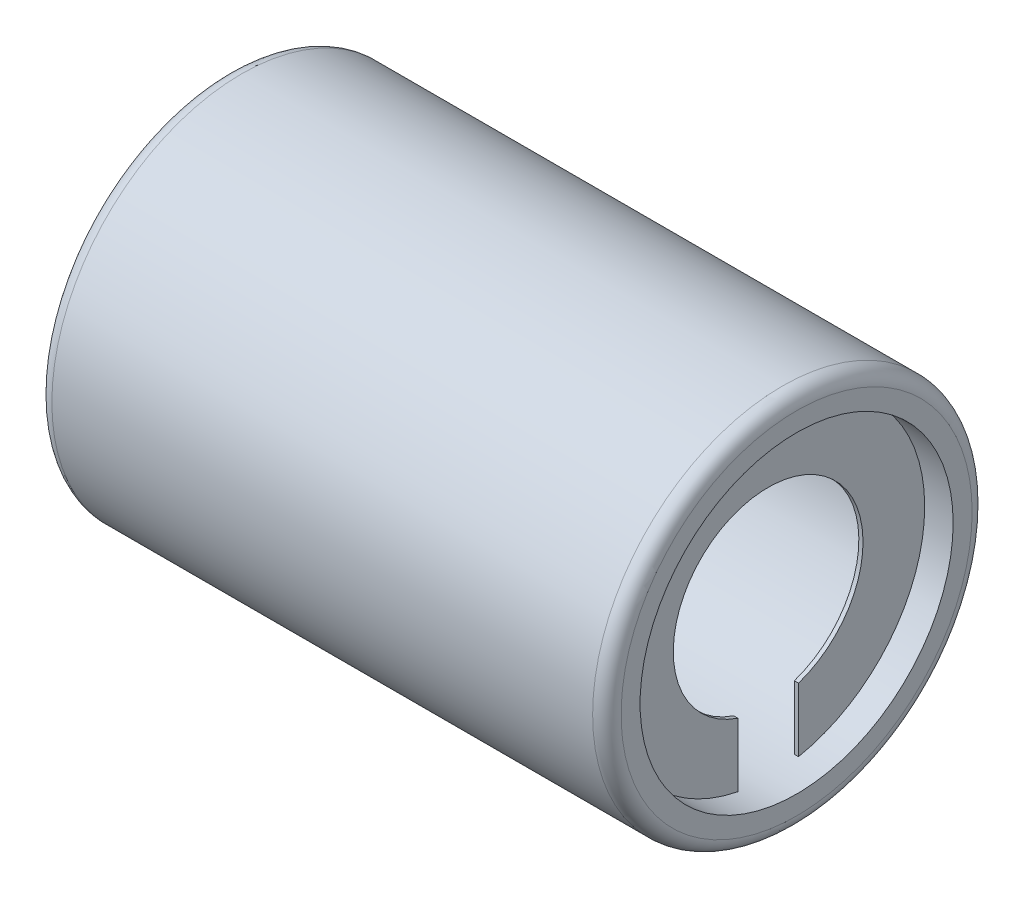
ISO-10303-21;
HEADER;
FILE_DESCRIPTION(('STEP AP214'),'2;1');
FILE_NAME('part.step','',(''),(''),'','','');
FILE_SCHEMA(('AUTOMOTIVE_DESIGN { 1 0 10303 214 1 1 1 1 }'));
ENDSEC;
DATA;
#1=APPLICATION_CONTEXT('core data for automotive mechanical design processes');
#2=APPLICATION_PROTOCOL_DEFINITION('international standard','automotive_design',2000,#1);
#3=PRODUCT_CONTEXT('',#1,'mechanical');
#4=PRODUCT('Part','Part','',(#3));
#5=PRODUCT_RELATED_PRODUCT_CATEGORY('part','',(#4));
#6=PRODUCT_DEFINITION_FORMATION('','',#4);
#7=PRODUCT_DEFINITION_CONTEXT('part definition',#1,'design');
#8=PRODUCT_DEFINITION('design','',#6,#7);
#9=PRODUCT_DEFINITION_SHAPE('','',#8);
#10=(LENGTH_UNIT() NAMED_UNIT(*) SI_UNIT(.MILLI.,.METRE.));
#11=(NAMED_UNIT(*) PLANE_ANGLE_UNIT() SI_UNIT($,.RADIAN.));
#12=(NAMED_UNIT(*) SI_UNIT($,.STERADIAN.) SOLID_ANGLE_UNIT());
#13=UNCERTAINTY_MEASURE_WITH_UNIT(LENGTH_MEASURE(1.E-05),#10,'distance_accuracy_value','');
#14=(GEOMETRIC_REPRESENTATION_CONTEXT(3) GLOBAL_UNCERTAINTY_ASSIGNED_CONTEXT((#13)) GLOBAL_UNIT_ASSIGNED_CONTEXT((#10,
#11,#12)) REPRESENTATION_CONTEXT('',''));
#15=CARTESIAN_POINT('',(0.,0.,0.));
#16=DIRECTION('',(0.,0.,1.));
#17=DIRECTION('',(1.,0.,0.));
#18=AXIS2_PLACEMENT_3D('',#15,#16,#17);
#19=CARTESIAN_POINT('',(12.,0.,0.));
#20=DIRECTION('',(1.,0.,0.));
#21=DIRECTION('',(0.,0.,-1.));
#22=AXIS2_PLACEMENT_3D('',#19,#20,#21);
#23=CYLINDRICAL_SURFACE('',#22,3.29999999999999);
#24=CARTESIAN_POINT('',(12.,0.,0.));
#25=DIRECTION('',(1.,0.,0.));
#26=DIRECTION('',(0.,0.,-1.));
#27=AXIS2_PLACEMENT_3D('',#24,#25,#26);
#28=CIRCLE('',#27,3.29999999999999);
#29=CARTESIAN_POINT('',(12.,0.,-3.29999999999999));
#30=VERTEX_POINT('',#29);
#31=EDGE_CURVE('E90',#30,#30,#28,.T.);
#32=ORIENTED_EDGE('',*,*,#31,.T.);
#33=EDGE_LOOP('',(#32));
#34=FACE_BOUND('',#33,.T.);
#35=CARTESIAN_POINT('',(11.4,0.,0.));
#36=DIRECTION('',(-1.,0.,0.));
#37=DIRECTION('',(0.,0.,1.));
#38=AXIS2_PLACEMENT_3D('',#35,#36,#37);
#39=CIRCLE('',#38,3.30000000000002);
#40=CARTESIAN_POINT('',(11.4,-3.2373445908646,0.64));
#41=VERTEX_POINT('',#40);
#42=CARTESIAN_POINT('',(11.4,-3.23734459086458,-0.639999999999994));
#43=VERTEX_POINT('',#42);
#44=EDGE_CURVE('E87',#41,#43,#39,.T.);
#45=ORIENTED_EDGE('',*,*,#44,.T.);
#46=DIRECTION('',(-1.,0.,0.));
#47=VECTOR('',#46,1.);
#48=CARTESIAN_POINT('',(11.4,-3.23734459086458,-0.639999999999994));
#49=LINE('',#48,#47);
#50=CARTESIAN_POINT('',(11.312,-3.23734459086458,-0.639999999999994));
#51=VERTEX_POINT('',#50);
#52=EDGE_CURVE('E61',#43,#51,#49,.T.);
#53=ORIENTED_EDGE('',*,*,#52,.T.);
#54=CARTESIAN_POINT('',(11.312,0.,0.));
#55=DIRECTION('',(-1.,0.,0.));
#56=DIRECTION('',(0.,0.,1.));
#57=AXIS2_PLACEMENT_3D('',#54,#55,#56);
#58=CIRCLE('',#57,3.30000000000002);
#59=CARTESIAN_POINT('',(11.312,-3.23734459086454,0.64));
#60=VERTEX_POINT('',#59);
#61=EDGE_CURVE('E73',#60,#51,#58,.T.);
#62=ORIENTED_EDGE('',*,*,#61,.F.);
#63=DIRECTION('',(-1.,0.,0.));
#64=VECTOR('',#63,1.);
#65=CARTESIAN_POINT('',(11.4,-3.2373445908646,0.64));
#66=LINE('',#65,#64);
#67=EDGE_CURVE('E88',#41,#60,#66,.T.);
#68=ORIENTED_EDGE('',*,*,#67,.F.);
#69=EDGE_LOOP('',(#45,#53,#62,#68));
#70=FACE_BOUND('',#69,.T.);
#71=CARTESIAN_POINT('',(0.,0.,0.));
#72=DIRECTION('',(1.,0.,0.));
#73=DIRECTION('',(0.,0.,-1.));
#74=AXIS2_PLACEMENT_3D('',#71,#72,#73);
#75=CIRCLE('',#74,3.29999999999999);
#76=CARTESIAN_POINT('',(0.,0.,-3.29999999999999));
#77=VERTEX_POINT('',#76);
#78=EDGE_CURVE('E99',#77,#77,#75,.T.);
#79=ORIENTED_EDGE('',*,*,#78,.F.);
#80=EDGE_LOOP('',(#79));
#81=FACE_BOUND('',#80,.T.);
#82=ADVANCED_FACE('F37',(#34,#70,#81),#23,.F.);
#83=CARTESIAN_POINT('',(12.,0.,0.));
#84=DIRECTION('',(-1.,0.,0.));
#85=DIRECTION('',(0.,0.,1.));
#86=AXIS2_PLACEMENT_3D('',#83,#84,#85);
#87=CYLINDRICAL_SURFACE('',#86,4.);
#88=CARTESIAN_POINT('',(0.3,0.,0.));
#89=DIRECTION('',(-1.,0.,0.));
#90=DIRECTION('',(0.,0.,1.));
#91=AXIS2_PLACEMENT_3D('',#88,#89,#90);
#92=CIRCLE('',#91,4.);
#93=CARTESIAN_POINT('',(0.3,0.,4.));
#94=VERTEX_POINT('',#93);
#95=EDGE_CURVE('E45',#94,#94,#92,.F.);
#96=ORIENTED_EDGE('',*,*,#95,.T.);
#97=EDGE_LOOP('',(#96));
#98=FACE_BOUND('',#97,.T.);
#99=CARTESIAN_POINT('',(11.7,0.,0.));
#100=DIRECTION('',(1.,0.,0.));
#101=DIRECTION('',(0.,0.,-1.));
#102=AXIS2_PLACEMENT_3D('',#99,#100,#101);
#103=CIRCLE('',#102,4.);
#104=CARTESIAN_POINT('',(11.7,0.,-4.));
#105=VERTEX_POINT('',#104);
#106=EDGE_CURVE('E108',#105,#105,#103,.F.);
#107=ORIENTED_EDGE('',*,*,#106,.T.);
#108=EDGE_LOOP('',(#107));
#109=FACE_BOUND('',#108,.T.);
#110=ADVANCED_FACE('F113',(#98,#109),#87,.T.);
#111=CARTESIAN_POINT('',(12.,4.,0.));
#112=DIRECTION('',(1.,0.,0.));
#113=DIRECTION('',(0.,0.,-1.));
#114=AXIS2_PLACEMENT_3D('',#111,#112,#113);
#115=PLANE('',#114);
#116=CARTESIAN_POINT('',(12.,0.,0.));
#117=DIRECTION('',(1.,0.,0.));
#118=DIRECTION('',(0.,0.,-1.));
#119=AXIS2_PLACEMENT_3D('',#116,#117,#118);
#120=CIRCLE('',#119,3.7);
#121=CARTESIAN_POINT('',(12.,0.,-3.7));
#122=VERTEX_POINT('',#121);
#123=EDGE_CURVE('E11',#122,#122,#120,.T.);
#124=ORIENTED_EDGE('',*,*,#123,.T.);
#125=EDGE_LOOP('',(#124));
#126=FACE_BOUND('',#125,.T.);
#127=ORIENTED_EDGE('',*,*,#31,.F.);
#128=EDGE_LOOP('',(#127));
#129=FACE_BOUND('',#128,.T.);
#130=ADVANCED_FACE('F125',(#126,#129),#115,.T.);
#131=CARTESIAN_POINT('',(0.,0.,0.));
#132=DIRECTION('',(-1.,0.,0.));
#133=DIRECTION('',(0.,0.,1.));
#134=AXIS2_PLACEMENT_3D('',#131,#132,#133);
#135=PLANE('',#134);
#136=CARTESIAN_POINT('',(0.,0.,0.));
#137=DIRECTION('',(-1.,0.,0.));
#138=DIRECTION('',(0.,0.,1.));
#139=AXIS2_PLACEMENT_3D('',#136,#137,#138);
#140=CIRCLE('',#139,3.7);
#141=CARTESIAN_POINT('',(0.,0.,3.7));
#142=VERTEX_POINT('',#141);
#143=EDGE_CURVE('E105',#142,#142,#140,.T.);
#144=ORIENTED_EDGE('',*,*,#143,.T.);
#145=EDGE_LOOP('',(#144));
#146=FACE_BOUND('',#145,.T.);
#147=ORIENTED_EDGE('',*,*,#78,.T.);
#148=EDGE_LOOP('',(#147));
#149=FACE_BOUND('',#148,.T.);
#150=ADVANCED_FACE('F122',(#146,#149),#135,.T.);
#151=CARTESIAN_POINT('',(11.4,-3.23734459086456,-0.63999999999999));
#152=DIRECTION('',(0.,0.,1.));
#153=DIRECTION('',(0.,-1.,0.));
#154=AXIS2_PLACEMENT_3D('',#151,#152,#153);
#155=PLANE('',#154);
#156=DIRECTION('',(0.,1.,0.));
#157=VECTOR('',#156,1.);
#158=CARTESIAN_POINT('',(11.312,-3.23734459086456,-0.63999999999999));
#159=LINE('',#158,#157);
#160=CARTESIAN_POINT('',(11.312,-1.89483508517232,-0.64));
#161=VERTEX_POINT('',#160);
#162=EDGE_CURVE('E75',#51,#161,#159,.T.);
#163=ORIENTED_EDGE('',*,*,#162,.F.);
#164=ORIENTED_EDGE('',*,*,#52,.F.);
#165=DIRECTION('',(0.,1.,0.));
#166=VECTOR('',#165,1.);
#167=CARTESIAN_POINT('',(11.4,-3.23734459086456,-0.63999999999999));
#168=LINE('',#167,#166);
#169=CARTESIAN_POINT('',(11.4,-1.89483508517232,-0.640000000000001));
#170=VERTEX_POINT('',#169);
#171=EDGE_CURVE('E96',#43,#170,#168,.T.);
#172=ORIENTED_EDGE('',*,*,#171,.T.);
#173=DIRECTION('',(-1.,0.,0.));
#174=VECTOR('',#173,1.);
#175=CARTESIAN_POINT('',(11.4,-1.89483508517232,-0.64));
#176=LINE('',#175,#174);
#177=EDGE_CURVE('E82',#170,#161,#176,.T.);
#178=ORIENTED_EDGE('',*,*,#177,.T.);
#179=EDGE_LOOP('',(#163,#164,#172,#178));
#180=FACE_BOUND('',#179,.T.);
#181=ADVANCED_FACE('F80',(#180),#155,.T.);
#182=CARTESIAN_POINT('',(11.4,-1.89483508517232,0.64));
#183=DIRECTION('',(0.,0.,-1.));
#184=DIRECTION('',(-1.,0.,0.));
#185=AXIS2_PLACEMENT_3D('',#182,#183,#184);
#186=PLANE('',#185);
#187=DIRECTION('',(0.,-1.,0.));
#188=VECTOR('',#187,1.);
#189=CARTESIAN_POINT('',(11.312,-1.89483508517232,0.64));
#190=LINE('',#189,#188);
#191=CARTESIAN_POINT('',(11.312,-1.89483508517232,0.64));
#192=VERTEX_POINT('',#191);
#193=EDGE_CURVE('E52',#192,#60,#190,.T.);
#194=ORIENTED_EDGE('',*,*,#193,.F.);
#195=DIRECTION('',(-1.,0.,0.));
#196=VECTOR('',#195,1.);
#197=CARTESIAN_POINT('',(11.4,-1.89483508517232,0.64));
#198=LINE('',#197,#196);
#199=CARTESIAN_POINT('',(11.4,-1.89483508517232,0.640000000000001));
#200=VERTEX_POINT('',#199);
#201=EDGE_CURVE('E92',#200,#192,#198,.T.);
#202=ORIENTED_EDGE('',*,*,#201,.F.);
#203=DIRECTION('',(0.,-1.,0.));
#204=VECTOR('',#203,1.);
#205=CARTESIAN_POINT('',(11.4,-1.89483508517232,0.64));
#206=LINE('',#205,#204);
#207=EDGE_CURVE('E83',#200,#41,#206,.T.);
#208=ORIENTED_EDGE('',*,*,#207,.T.);
#209=ORIENTED_EDGE('',*,*,#67,.T.);
#210=EDGE_LOOP('',(#194,#202,#208,#209));
#211=FACE_BOUND('',#210,.T.);
#212=ADVANCED_FACE('F136',(#211),#186,.T.);
#213=CARTESIAN_POINT('',(11.4,0.,0.));
#214=DIRECTION('',(-1.,0.,0.));
#215=DIRECTION('',(0.,0.,1.));
#216=AXIS2_PLACEMENT_3D('',#213,#214,#215);
#217=PLANE('',#216);
#218=ORIENTED_EDGE('',*,*,#207,.F.);
#219=CARTESIAN_POINT('',(11.4,0.,0.));
#220=DIRECTION('',(-1.,0.,0.));
#221=DIRECTION('',(0.,0.,1.));
#222=AXIS2_PLACEMENT_3D('',#219,#220,#221);
#223=CIRCLE('',#222,2.);
#224=EDGE_CURVE('E228',#200,#170,#223,.T.);
#225=ORIENTED_EDGE('',*,*,#224,.T.);
#226=ORIENTED_EDGE('',*,*,#171,.F.);
#227=ORIENTED_EDGE('',*,*,#44,.F.);
#228=EDGE_LOOP('',(#218,#225,#226,#227));
#229=FACE_BOUND('',#228,.T.);
#230=ADVANCED_FACE('F171',(#229),#217,.F.);
#231=CARTESIAN_POINT('',(11.312,0.,0.));
#232=DIRECTION('',(-1.,0.,0.));
#233=DIRECTION('',(0.,0.,1.));
#234=AXIS2_PLACEMENT_3D('',#231,#232,#233);
#235=PLANE('',#234);
#236=CARTESIAN_POINT('',(11.312,0.,0.));
#237=DIRECTION('',(-1.,0.,0.));
#238=DIRECTION('',(0.,0.,1.));
#239=AXIS2_PLACEMENT_3D('',#236,#237,#238);
#240=CIRCLE('',#239,2.);
#241=EDGE_CURVE('E102',#192,#161,#240,.T.);
#242=ORIENTED_EDGE('',*,*,#241,.F.);
#243=ORIENTED_EDGE('',*,*,#193,.T.);
#244=ORIENTED_EDGE('',*,*,#61,.T.);
#245=ORIENTED_EDGE('',*,*,#162,.T.);
#246=EDGE_LOOP('',(#242,#243,#244,#245));
#247=FACE_BOUND('',#246,.T.);
#248=ADVANCED_FACE('F74',(#247),#235,.T.);
#249=CARTESIAN_POINT('',(11.4,0.,0.));
#250=DIRECTION('',(-1.,0.,0.));
#251=DIRECTION('',(0.,0.,1.));
#252=AXIS2_PLACEMENT_3D('',#249,#250,#251);
#253=CYLINDRICAL_SURFACE('',#252,2.);
#254=ORIENTED_EDGE('',*,*,#177,.F.);
#255=ORIENTED_EDGE('',*,*,#224,.F.);
#256=ORIENTED_EDGE('',*,*,#201,.T.);
#257=ORIENTED_EDGE('',*,*,#241,.T.);
#258=EDGE_LOOP('',(#254,#255,#256,#257));
#259=FACE_BOUND('',#258,.T.);
#260=ADVANCED_FACE('F119',(#259),#253,.F.);
#261=CARTESIAN_POINT('',(0.3,0.,0.));
#262=DIRECTION('',(-1.,0.,0.));
#263=DIRECTION('',(0.,0.,1.));
#264=AXIS2_PLACEMENT_3D('',#261,#262,#263);
#265=TOROIDAL_SURFACE('',#264,3.7,0.3);
#266=ORIENTED_EDGE('',*,*,#95,.F.);
#267=EDGE_LOOP('',(#266));
#268=FACE_BOUND('',#267,.T.);
#269=ORIENTED_EDGE('',*,*,#143,.F.);
#270=EDGE_LOOP('',(#269));
#271=FACE_BOUND('',#270,.T.);
#272=ADVANCED_FACE('F116',(#268,#271),#265,.T.);
#273=CARTESIAN_POINT('',(11.7,0.,0.));
#274=DIRECTION('',(1.,0.,0.));
#275=DIRECTION('',(0.,0.,-1.));
#276=AXIS2_PLACEMENT_3D('',#273,#274,#275);
#277=TOROIDAL_SURFACE('',#276,3.7,0.3);
#278=ORIENTED_EDGE('',*,*,#123,.F.);
#279=EDGE_LOOP('',(#278));
#280=FACE_BOUND('',#279,.T.);
#281=ORIENTED_EDGE('',*,*,#106,.F.);
#282=EDGE_LOOP('',(#281));
#283=FACE_BOUND('',#282,.T.);
#284=ADVANCED_FACE('F39',(#280,#283),#277,.T.);
#285=CLOSED_SHELL('',(#82,#110,#130,#150,#181,#212,#230,#248,#260,#272,#284));
#286=MANIFOLD_SOLID_BREP('B2',#285);
#287=ADVANCED_BREP_SHAPE_REPRESENTATION('',(#18,#286),#14);
#288=SHAPE_DEFINITION_REPRESENTATION(#9,#287);
ENDSEC;
END-ISO-10303-21;
